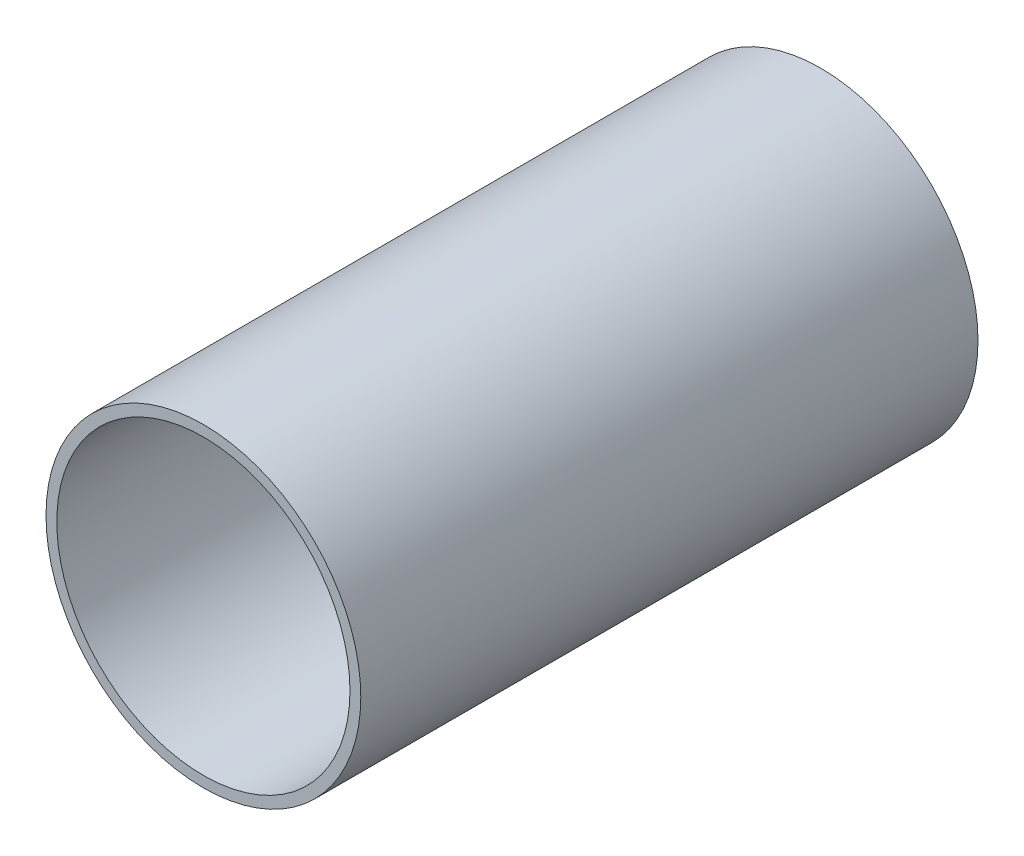
ISO-10303-21;
HEADER;
FILE_DESCRIPTION(('STEP AP214'),'2;1');
FILE_NAME('part.step','',(''),(''),'','','');
FILE_SCHEMA(('AUTOMOTIVE_DESIGN { 1 0 10303 214 1 1 1 1 }'));
ENDSEC;
DATA;
#1=APPLICATION_CONTEXT('core data for automotive mechanical design processes');
#2=APPLICATION_PROTOCOL_DEFINITION('international standard','automotive_design',2000,#1);
#3=PRODUCT_CONTEXT('',#1,'mechanical');
#4=PRODUCT('Part','Part','',(#3));
#5=PRODUCT_RELATED_PRODUCT_CATEGORY('part','',(#4));
#6=PRODUCT_DEFINITION_FORMATION('','',#4);
#7=PRODUCT_DEFINITION_CONTEXT('part definition',#1,'design');
#8=PRODUCT_DEFINITION('design','',#6,#7);
#9=PRODUCT_DEFINITION_SHAPE('','',#8);
#10=(LENGTH_UNIT() NAMED_UNIT(*) SI_UNIT(.MILLI.,.METRE.));
#11=(NAMED_UNIT(*) PLANE_ANGLE_UNIT() SI_UNIT($,.RADIAN.));
#12=(NAMED_UNIT(*) SI_UNIT($,.STERADIAN.) SOLID_ANGLE_UNIT());
#13=UNCERTAINTY_MEASURE_WITH_UNIT(LENGTH_MEASURE(1.E-05),#10,'distance_accuracy_value','');
#14=(GEOMETRIC_REPRESENTATION_CONTEXT(3) GLOBAL_UNCERTAINTY_ASSIGNED_CONTEXT((#13)) GLOBAL_UNIT_ASSIGNED_CONTEXT((#10,
#11,#12)) REPRESENTATION_CONTEXT('',''));
#15=CARTESIAN_POINT('',(0.,0.,0.));
#16=DIRECTION('',(0.,0.,1.));
#17=DIRECTION('',(1.,0.,0.));
#18=AXIS2_PLACEMENT_3D('',#15,#16,#17);
#19=CARTESIAN_POINT('',(0.,0.,10.));
#20=DIRECTION('',(0.,0.,1.));
#21=DIRECTION('',(1.,0.,0.));
#22=AXIS2_PLACEMENT_3D('',#19,#20,#21);
#23=PLANE('',#22);
#24=CARTESIAN_POINT('',(0.,0.,10.));
#25=DIRECTION('',(0.,0.,1.));
#26=DIRECTION('',(1.,0.,0.));
#27=AXIS2_PLACEMENT_3D('',#24,#25,#26);
#28=CIRCLE('',#27,2.55);
#29=CARTESIAN_POINT('',(2.55,0.,10.));
#30=VERTEX_POINT('',#29);
#31=EDGE_CURVE('E10',#30,#30,#28,.T.);
#32=ORIENTED_EDGE('',*,*,#31,.T.);
#33=EDGE_LOOP('',(#32));
#34=FACE_BOUND('',#33,.T.);
#35=CARTESIAN_POINT('',(0.,0.,10.));
#36=DIRECTION('',(0.,0.,1.));
#37=DIRECTION('',(1.,0.,0.));
#38=AXIS2_PLACEMENT_3D('',#35,#36,#37);
#39=CIRCLE('',#38,2.375);
#40=CARTESIAN_POINT('',(2.375,0.,10.));
#41=VERTEX_POINT('',#40);
#42=EDGE_CURVE('E53',#41,#41,#39,.T.);
#43=ORIENTED_EDGE('',*,*,#42,.F.);
#44=EDGE_LOOP('',(#43));
#45=FACE_BOUND('',#44,.T.);
#46=ADVANCED_FACE('F39',(#34,#45),#23,.T.);
#47=CARTESIAN_POINT('',(0.,0.,0.));
#48=DIRECTION('',(0.,0.,1.));
#49=DIRECTION('',(1.,0.,0.));
#50=AXIS2_PLACEMENT_3D('',#47,#48,#49);
#51=PLANE('',#50);
#52=CARTESIAN_POINT('',(0.,0.,0.));
#53=DIRECTION('',(0.,0.,1.));
#54=DIRECTION('',(1.,0.,0.));
#55=AXIS2_PLACEMENT_3D('',#52,#53,#54);
#56=CIRCLE('',#55,2.55);
#57=CARTESIAN_POINT('',(2.55,0.,0.));
#58=VERTEX_POINT('',#57);
#59=EDGE_CURVE('E43',#58,#58,#56,.T.);
#60=ORIENTED_EDGE('',*,*,#59,.F.);
#61=EDGE_LOOP('',(#60));
#62=FACE_BOUND('',#61,.T.);
#63=CARTESIAN_POINT('',(0.,0.,0.));
#64=DIRECTION('',(0.,0.,1.));
#65=DIRECTION('',(1.,0.,0.));
#66=AXIS2_PLACEMENT_3D('',#63,#64,#65);
#67=CIRCLE('',#66,2.375);
#68=CARTESIAN_POINT('',(2.375,0.,0.));
#69=VERTEX_POINT('',#68);
#70=EDGE_CURVE('E55',#69,#69,#67,.T.);
#71=ORIENTED_EDGE('',*,*,#70,.T.);
#72=EDGE_LOOP('',(#71));
#73=FACE_BOUND('',#72,.T.);
#74=ADVANCED_FACE('F66',(#62,#73),#51,.F.);
#75=CARTESIAN_POINT('',(0.,0.,10.));
#76=DIRECTION('',(0.,0.,-1.));
#77=DIRECTION('',(-1.,0.,0.));
#78=AXIS2_PLACEMENT_3D('',#75,#76,#77);
#79=CYLINDRICAL_SURFACE('',#78,2.55);
#80=ORIENTED_EDGE('',*,*,#31,.F.);
#81=EDGE_LOOP('',(#80));
#82=FACE_BOUND('',#81,.T.);
#83=ORIENTED_EDGE('',*,*,#59,.T.);
#84=EDGE_LOOP('',(#83));
#85=FACE_BOUND('',#84,.T.);
#86=ADVANCED_FACE('F41',(#82,#85),#79,.T.);
#87=CARTESIAN_POINT('',(0.,0.,10.));
#88=DIRECTION('',(0.,0.,-1.));
#89=DIRECTION('',(-1.,0.,0.));
#90=AXIS2_PLACEMENT_3D('',#87,#88,#89);
#91=CYLINDRICAL_SURFACE('',#90,2.375);
#92=ORIENTED_EDGE('',*,*,#42,.T.);
#93=EDGE_LOOP('',(#92));
#94=FACE_BOUND('',#93,.T.);
#95=ORIENTED_EDGE('',*,*,#70,.F.);
#96=EDGE_LOOP('',(#95));
#97=FACE_BOUND('',#96,.T.);
#98=ADVANCED_FACE('F62',(#94,#97),#91,.F.);
#99=CLOSED_SHELL('',(#46,#74,#86,#98));
#100=MANIFOLD_SOLID_BREP('B2',#99);
#101=ADVANCED_BREP_SHAPE_REPRESENTATION('',(#18,#100),#14);
#102=SHAPE_DEFINITION_REPRESENTATION(#9,#101);
ENDSEC;
END-ISO-10303-21;
